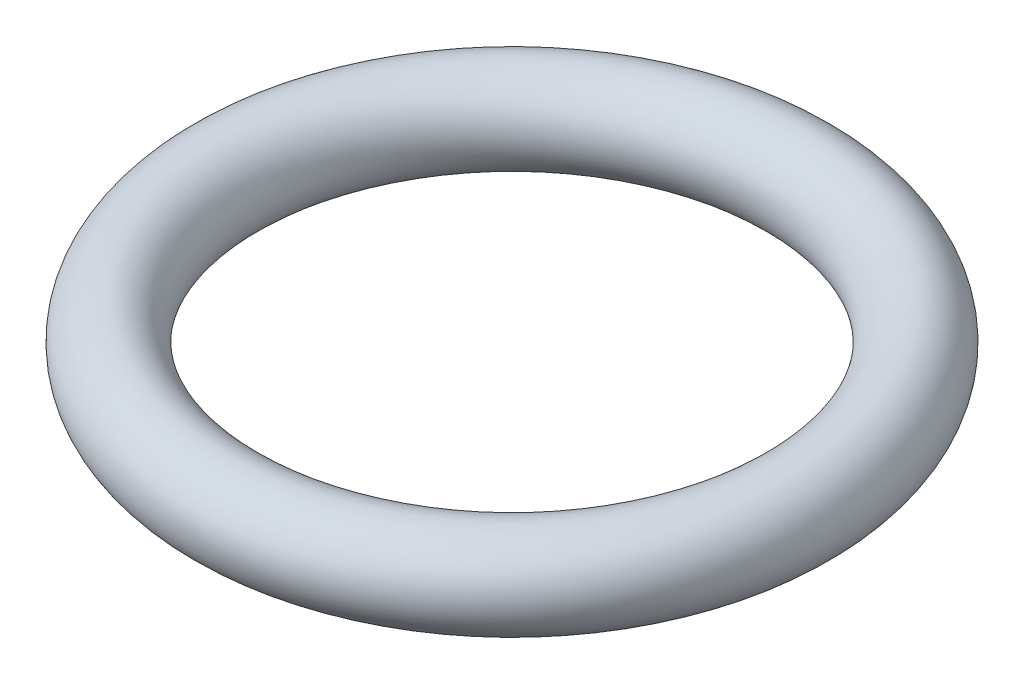
ISO-10303-21;
HEADER;
FILE_DESCRIPTION(('STEP AP214'),'2;1');
FILE_NAME('part.step','',(''),(''),'','','');
FILE_SCHEMA(('AUTOMOTIVE_DESIGN { 1 0 10303 214 1 1 1 1 }'));
ENDSEC;
DATA;
#1=APPLICATION_CONTEXT('core data for automotive mechanical design processes');
#2=APPLICATION_PROTOCOL_DEFINITION('international standard','automotive_design',2000,#1);
#3=PRODUCT_CONTEXT('',#1,'mechanical');
#4=PRODUCT('Part','Part','',(#3));
#5=PRODUCT_RELATED_PRODUCT_CATEGORY('part','',(#4));
#6=PRODUCT_DEFINITION_FORMATION('','',#4);
#7=PRODUCT_DEFINITION_CONTEXT('part definition',#1,'design');
#8=PRODUCT_DEFINITION('design','',#6,#7);
#9=PRODUCT_DEFINITION_SHAPE('','',#8);
#10=(LENGTH_UNIT() NAMED_UNIT(*) SI_UNIT(.MILLI.,.METRE.));
#11=(NAMED_UNIT(*) PLANE_ANGLE_UNIT() SI_UNIT($,.RADIAN.));
#12=(NAMED_UNIT(*) SI_UNIT($,.STERADIAN.) SOLID_ANGLE_UNIT());
#13=UNCERTAINTY_MEASURE_WITH_UNIT(LENGTH_MEASURE(1.E-05),#10,'distance_accuracy_value','');
#14=(GEOMETRIC_REPRESENTATION_CONTEXT(3) GLOBAL_UNCERTAINTY_ASSIGNED_CONTEXT((#13)) GLOBAL_UNIT_ASSIGNED_CONTEXT((#10,
#11,#12)) REPRESENTATION_CONTEXT('',''));
#15=CARTESIAN_POINT('',(0.,0.,0.));
#16=DIRECTION('',(0.,0.,1.));
#17=DIRECTION('',(1.,0.,0.));
#18=AXIS2_PLACEMENT_3D('',#15,#16,#17);
#19=CARTESIAN_POINT('',(0.,0.,0.));
#20=DIRECTION('',(0.,-1.,0.));
#21=DIRECTION('',(0.,0.,-1.));
#22=AXIS2_PLACEMENT_3D('',#19,#20,#21);
#23=TOROIDAL_SURFACE('',#22,4.85,0.749999999999999);
#24=ADVANCED_FACE('F14',(),#23,.T.);
#25=CLOSED_SHELL('',(#24));
#26=MANIFOLD_SOLID_BREP('B1',#25);
#27=ADVANCED_BREP_SHAPE_REPRESENTATION('',(#18,#26),#14);
#28=SHAPE_DEFINITION_REPRESENTATION(#9,#27);
ENDSEC;
END-ISO-10303-21;
